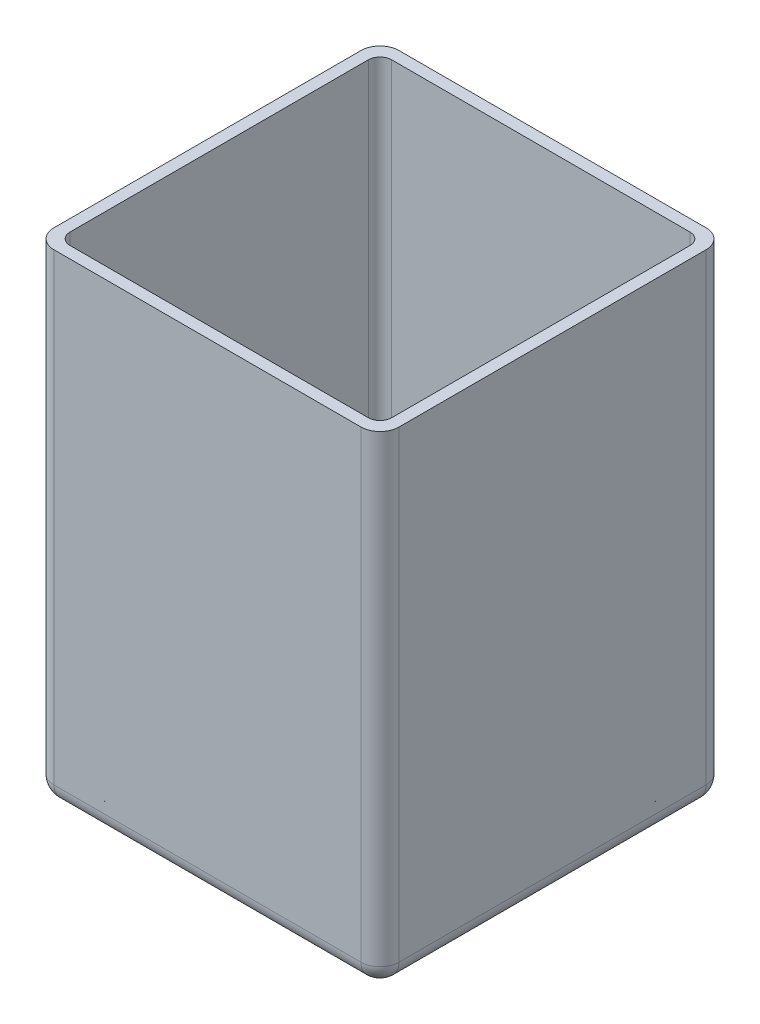
ISO-10303-21;
HEADER;
FILE_DESCRIPTION(('STEP AP214'),'2;1');
FILE_NAME('part.step','',(''),(''),'','','');
FILE_SCHEMA(('AUTOMOTIVE_DESIGN { 1 0 10303 214 1 1 1 1 }'));
ENDSEC;
DATA;
#1=APPLICATION_CONTEXT('core data for automotive mechanical design processes');
#2=APPLICATION_PROTOCOL_DEFINITION('international standard','automotive_design',2000,#1);
#3=PRODUCT_CONTEXT('',#1,'mechanical');
#4=PRODUCT('Part','Part','',(#3));
#5=PRODUCT_RELATED_PRODUCT_CATEGORY('part','',(#4));
#6=PRODUCT_DEFINITION_FORMATION('','',#4);
#7=PRODUCT_DEFINITION_CONTEXT('part definition',#1,'design');
#8=PRODUCT_DEFINITION('design','',#6,#7);
#9=PRODUCT_DEFINITION_SHAPE('','',#8);
#10=(LENGTH_UNIT() NAMED_UNIT(*) SI_UNIT(.MILLI.,.METRE.));
#11=(NAMED_UNIT(*) PLANE_ANGLE_UNIT() SI_UNIT($,.RADIAN.));
#12=(NAMED_UNIT(*) SI_UNIT($,.STERADIAN.) SOLID_ANGLE_UNIT());
#13=UNCERTAINTY_MEASURE_WITH_UNIT(LENGTH_MEASURE(1.E-05),#10,'distance_accuracy_value','');
#14=(GEOMETRIC_REPRESENTATION_CONTEXT(3) GLOBAL_UNCERTAINTY_ASSIGNED_CONTEXT((#13)) GLOBAL_UNIT_ASSIGNED_CONTEXT((#10,
#11,#12)) REPRESENTATION_CONTEXT('',''));
#15=CARTESIAN_POINT('',(0.,0.,0.));
#16=DIRECTION('',(0.,0.,1.));
#17=DIRECTION('',(1.,0.,0.));
#18=AXIS2_PLACEMENT_3D('',#15,#16,#17);
#19=CARTESIAN_POINT('',(59.,165.,-59.));
#20=DIRECTION('',(-1.,0.,0.));
#21=DIRECTION('',(0.,0.,1.));
#22=AXIS2_PLACEMENT_3D('',#19,#20,#21);
#23=PLANE('',#22);
#24=DIRECTION('',(0.,0.,-1.));
#25=VECTOR('',#24,1.);
#26=CARTESIAN_POINT('',(59.,6.50000000000001,-59.));
#27=LINE('',#26,#25);
#28=CARTESIAN_POINT('',(59.,6.50000000000001,52.5));
#29=VERTEX_POINT('',#28);
#30=CARTESIAN_POINT('',(59.,6.50000000000001,-52.5));
#31=VERTEX_POINT('',#30);
#32=EDGE_CURVE('E57',#29,#31,#27,.T.);
#33=ORIENTED_EDGE('',*,*,#32,.T.);
#34=DIRECTION('',(0.,-1.,0.));
#35=VECTOR('',#34,1.);
#36=CARTESIAN_POINT('',(59.,165.,-52.5));
#37=LINE('',#36,#35);
#38=CARTESIAN_POINT('',(59.,165.,-52.5));
#39=VERTEX_POINT('',#38);
#40=EDGE_CURVE('E349',#31,#39,#37,.F.);
#41=ORIENTED_EDGE('',*,*,#40,.T.);
#42=DIRECTION('',(0.,0.,-1.));
#43=VECTOR('',#42,1.);
#44=CARTESIAN_POINT('',(59.,165.,-59.));
#45=LINE('',#44,#43);
#46=CARTESIAN_POINT('',(59.,165.,52.5));
#47=VERTEX_POINT('',#46);
#48=EDGE_CURVE('E423',#47,#39,#45,.T.);
#49=ORIENTED_EDGE('',*,*,#48,.F.);
#50=DIRECTION('',(0.,-1.,0.));
#51=VECTOR('',#50,1.);
#52=CARTESIAN_POINT('',(59.,165.,52.5));
#53=LINE('',#52,#51);
#54=EDGE_CURVE('E62',#47,#29,#53,.T.);
#55=ORIENTED_EDGE('',*,*,#54,.T.);
#56=EDGE_LOOP('',(#33,#41,#49,#55));
#57=FACE_BOUND('',#56,.T.);
#58=ADVANCED_FACE('F39',(#57),#23,.F.);
#59=CARTESIAN_POINT('',(-59.,165.,-59.));
#60=DIRECTION('',(0.,0.,1.));
#61=DIRECTION('',(1.,0.,0.));
#62=AXIS2_PLACEMENT_3D('',#59,#60,#61);
#63=PLANE('',#62);
#64=DIRECTION('',(-1.,0.,0.));
#65=VECTOR('',#64,1.);
#66=CARTESIAN_POINT('',(-59.,6.50000000000001,-59.));
#67=LINE('',#66,#65);
#68=CARTESIAN_POINT('',(52.5,6.50000000000001,-59.));
#69=VERTEX_POINT('',#68);
#70=CARTESIAN_POINT('',(-52.5,6.50000000000001,-59.));
#71=VERTEX_POINT('',#70);
#72=EDGE_CURVE('E307',#69,#71,#67,.T.);
#73=ORIENTED_EDGE('',*,*,#72,.T.);
#74=DIRECTION('',(0.,-1.,0.));
#75=VECTOR('',#74,1.);
#76=CARTESIAN_POINT('',(-52.5,165.,-59.));
#77=LINE('',#76,#75);
#78=CARTESIAN_POINT('',(-52.5,165.,-59.));
#79=VERTEX_POINT('',#78);
#80=EDGE_CURVE('E311',#71,#79,#77,.F.);
#81=ORIENTED_EDGE('',*,*,#80,.T.);
#82=DIRECTION('',(-1.,0.,0.));
#83=VECTOR('',#82,1.);
#84=CARTESIAN_POINT('',(-59.,165.,-59.));
#85=LINE('',#84,#83);
#86=CARTESIAN_POINT('',(52.5,165.,-59.));
#87=VERTEX_POINT('',#86);
#88=EDGE_CURVE('E431',#87,#79,#85,.T.);
#89=ORIENTED_EDGE('',*,*,#88,.F.);
#90=DIRECTION('',(0.,-1.,0.));
#91=VECTOR('',#90,1.);
#92=CARTESIAN_POINT('',(52.5,165.,-59.));
#93=LINE('',#92,#91);
#94=EDGE_CURVE('E269',#87,#69,#93,.T.);
#95=ORIENTED_EDGE('',*,*,#94,.T.);
#96=EDGE_LOOP('',(#73,#81,#89,#95));
#97=FACE_BOUND('',#96,.T.);
#98=ADVANCED_FACE('F518',(#97),#63,.F.);
#99=CARTESIAN_POINT('',(-59.,165.,-59.));
#100=DIRECTION('',(1.,0.,0.));
#101=DIRECTION('',(0.,0.,-1.));
#102=AXIS2_PLACEMENT_3D('',#99,#100,#101);
#103=PLANE('',#102);
#104=DIRECTION('',(0.,0.,1.));
#105=VECTOR('',#104,1.);
#106=CARTESIAN_POINT('',(-59.,165.,-59.));
#107=LINE('',#106,#105);
#108=CARTESIAN_POINT('',(-59.,165.,-52.5));
#109=VERTEX_POINT('',#108);
#110=CARTESIAN_POINT('',(-59.,165.,52.5));
#111=VERTEX_POINT('',#110);
#112=EDGE_CURVE('E436',#109,#111,#107,.T.);
#113=ORIENTED_EDGE('',*,*,#112,.F.);
#114=DIRECTION('',(0.,-1.,0.));
#115=VECTOR('',#114,1.);
#116=CARTESIAN_POINT('',(-59.,165.,-52.5));
#117=LINE('',#116,#115);
#118=CARTESIAN_POINT('',(-59.,6.50000000000001,-52.5));
#119=VERTEX_POINT('',#118);
#120=EDGE_CURVE('E333',#109,#119,#117,.T.);
#121=ORIENTED_EDGE('',*,*,#120,.T.);
#122=DIRECTION('',(0.,0.,1.));
#123=VECTOR('',#122,1.);
#124=CARTESIAN_POINT('',(-59.,6.50000000000001,-59.));
#125=LINE('',#124,#123);
#126=CARTESIAN_POINT('',(-59.,6.50000000000001,52.5));
#127=VERTEX_POINT('',#126);
#128=EDGE_CURVE('E330',#119,#127,#125,.T.);
#129=ORIENTED_EDGE('',*,*,#128,.T.);
#130=DIRECTION('',(0.,-1.,0.));
#131=VECTOR('',#130,1.);
#132=CARTESIAN_POINT('',(-59.,165.,52.5));
#133=LINE('',#132,#131);
#134=EDGE_CURVE('E327',#127,#111,#133,.F.);
#135=ORIENTED_EDGE('',*,*,#134,.T.);
#136=EDGE_LOOP('',(#113,#121,#129,#135));
#137=FACE_BOUND('',#136,.T.);
#138=ADVANCED_FACE('F523',(#137),#103,.F.);
#139=CARTESIAN_POINT('',(-59.,165.,59.));
#140=DIRECTION('',(0.,0.,-1.));
#141=DIRECTION('',(-1.,0.,0.));
#142=AXIS2_PLACEMENT_3D('',#139,#140,#141);
#143=PLANE('',#142);
#144=DIRECTION('',(1.,0.,0.));
#145=VECTOR('',#144,1.);
#146=CARTESIAN_POINT('',(-59.,165.,59.));
#147=LINE('',#146,#145);
#148=CARTESIAN_POINT('',(-52.5,165.,59.));
#149=VERTEX_POINT('',#148);
#150=CARTESIAN_POINT('',(52.5,165.,59.));
#151=VERTEX_POINT('',#150);
#152=EDGE_CURVE('E211',#149,#151,#147,.T.);
#153=ORIENTED_EDGE('',*,*,#152,.F.);
#154=DIRECTION('',(0.,-1.,0.));
#155=VECTOR('',#154,1.);
#156=CARTESIAN_POINT('',(-52.5,165.,59.));
#157=LINE('',#156,#155);
#158=CARTESIAN_POINT('',(-52.5,6.50000000000001,59.));
#159=VERTEX_POINT('',#158);
#160=EDGE_CURVE('E342',#149,#159,#157,.T.);
#161=ORIENTED_EDGE('',*,*,#160,.T.);
#162=DIRECTION('',(1.,0.,0.));
#163=VECTOR('',#162,1.);
#164=CARTESIAN_POINT('',(-59.,6.50000000000001,59.));
#165=LINE('',#164,#163);
#166=CARTESIAN_POINT('',(52.5,6.50000000000001,59.));
#167=VERTEX_POINT('',#166);
#168=EDGE_CURVE('E339',#159,#167,#165,.T.);
#169=ORIENTED_EDGE('',*,*,#168,.T.);
#170=DIRECTION('',(0.,-1.,0.));
#171=VECTOR('',#170,1.);
#172=CARTESIAN_POINT('',(52.5,165.,59.));
#173=LINE('',#172,#171);
#174=EDGE_CURVE('E336',#167,#151,#173,.F.);
#175=ORIENTED_EDGE('',*,*,#174,.T.);
#176=EDGE_LOOP('',(#153,#161,#169,#175));
#177=FACE_BOUND('',#176,.T.);
#178=ADVANCED_FACE('F769',(#177),#143,.F.);
#179=CARTESIAN_POINT('',(0.,165.,0.));
#180=DIRECTION('',(0.,1.,0.));
#181=DIRECTION('',(0.,0.,1.));
#182=AXIS2_PLACEMENT_3D('',#179,#180,#181);
#183=PLANE('',#182);
#184=DIRECTION('',(0.,0.,-1.));
#185=VECTOR('',#184,1.);
#186=CARTESIAN_POINT('',(55.,165.,-59.));
#187=LINE('',#186,#185);
#188=CARTESIAN_POINT('',(55.,165.,51.));
#189=VERTEX_POINT('',#188);
#190=CARTESIAN_POINT('',(55.,165.,-51.));
#191=VERTEX_POINT('',#190);
#192=EDGE_CURVE('E304',#189,#191,#187,.T.);
#193=ORIENTED_EDGE('',*,*,#192,.F.);
#194=CARTESIAN_POINT('',(51.,165.,51.));
#195=DIRECTION('',(0.,1.,0.));
#196=DIRECTION('',(0.,0.,1.));
#197=AXIS2_PLACEMENT_3D('',#194,#195,#196);
#198=CIRCLE('',#197,4.);
#199=CARTESIAN_POINT('',(51.,165.,55.));
#200=VERTEX_POINT('',#199);
#201=EDGE_CURVE('E261',#189,#200,#198,.F.);
#202=ORIENTED_EDGE('',*,*,#201,.T.);
#203=DIRECTION('',(1.,0.,0.));
#204=VECTOR('',#203,1.);
#205=CARTESIAN_POINT('',(-59.,165.,55.));
#206=LINE('',#205,#204);
#207=CARTESIAN_POINT('',(-51.,165.,55.));
#208=VERTEX_POINT('',#207);
#209=EDGE_CURVE('E432',#208,#200,#206,.T.);
#210=ORIENTED_EDGE('',*,*,#209,.F.);
#211=CARTESIAN_POINT('',(-51.,165.,51.));
#212=DIRECTION('',(0.,1.,0.));
#213=DIRECTION('',(0.,0.,1.));
#214=AXIS2_PLACEMENT_3D('',#211,#212,#213);
#215=CIRCLE('',#214,4.);
#216=CARTESIAN_POINT('',(-55.,165.,51.));
#217=VERTEX_POINT('',#216);
#218=EDGE_CURVE('E264',#208,#217,#215,.F.);
#219=ORIENTED_EDGE('',*,*,#218,.T.);
#220=DIRECTION('',(0.,0.,1.));
#221=VECTOR('',#220,1.);
#222=CARTESIAN_POINT('',(-55.,165.,-59.));
#223=LINE('',#222,#221);
#224=CARTESIAN_POINT('',(-55.,165.,-51.));
#225=VERTEX_POINT('',#224);
#226=EDGE_CURVE('E439',#225,#217,#223,.T.);
#227=ORIENTED_EDGE('',*,*,#226,.F.);
#228=CARTESIAN_POINT('',(-51.,165.,-51.));
#229=DIRECTION('',(0.,1.,0.));
#230=DIRECTION('',(0.,0.,1.));
#231=AXIS2_PLACEMENT_3D('',#228,#229,#230);
#232=CIRCLE('',#231,4.);
#233=CARTESIAN_POINT('',(-51.,165.,-55.));
#234=VERTEX_POINT('',#233);
#235=EDGE_CURVE('E267',#225,#234,#232,.F.);
#236=ORIENTED_EDGE('',*,*,#235,.T.);
#237=DIRECTION('',(-1.,0.,0.));
#238=VECTOR('',#237,1.);
#239=CARTESIAN_POINT('',(-59.,165.,-55.));
#240=LINE('',#239,#238);
#241=CARTESIAN_POINT('',(51.,165.,-55.));
#242=VERTEX_POINT('',#241);
#243=EDGE_CURVE('E486',#242,#234,#240,.T.);
#244=ORIENTED_EDGE('',*,*,#243,.F.);
#245=CARTESIAN_POINT('',(51.,165.,-51.));
#246=DIRECTION('',(0.,1.,0.));
#247=DIRECTION('',(0.,0.,1.));
#248=AXIS2_PLACEMENT_3D('',#245,#246,#247);
#249=CIRCLE('',#248,4.);
#250=EDGE_CURVE('E258',#242,#191,#249,.F.);
#251=ORIENTED_EDGE('',*,*,#250,.T.);
#252=EDGE_LOOP('',(#193,#202,#210,#219,#227,#236,#244,#251));
#253=FACE_BOUND('',#252,.T.);
#254=ORIENTED_EDGE('',*,*,#88,.T.);
#255=CARTESIAN_POINT('',(-52.5,165.,-52.5));
#256=DIRECTION('',(0.,1.,0.));
#257=DIRECTION('',(0.,0.,1.));
#258=AXIS2_PLACEMENT_3D('',#255,#256,#257);
#259=CIRCLE('',#258,6.5);
#260=EDGE_CURVE('E11',#79,#109,#259,.T.);
#261=ORIENTED_EDGE('',*,*,#260,.T.);
#262=ORIENTED_EDGE('',*,*,#112,.T.);
#263=CARTESIAN_POINT('',(-52.5,165.,52.5));
#264=DIRECTION('',(0.,1.,0.));
#265=DIRECTION('',(0.,0.,1.));
#266=AXIS2_PLACEMENT_3D('',#263,#264,#265);
#267=CIRCLE('',#266,6.5);
#268=EDGE_CURVE('E49',#111,#149,#267,.T.);
#269=ORIENTED_EDGE('',*,*,#268,.T.);
#270=ORIENTED_EDGE('',*,*,#152,.T.);
#271=CARTESIAN_POINT('',(52.5,165.,52.5));
#272=DIRECTION('',(0.,1.,0.));
#273=DIRECTION('',(0.,0.,1.));
#274=AXIS2_PLACEMENT_3D('',#271,#272,#273);
#275=CIRCLE('',#274,6.5);
#276=EDGE_CURVE('E352',#151,#47,#275,.T.);
#277=ORIENTED_EDGE('',*,*,#276,.T.);
#278=ORIENTED_EDGE('',*,*,#48,.T.);
#279=CARTESIAN_POINT('',(52.5,165.,-52.5));
#280=DIRECTION('',(0.,1.,0.));
#281=DIRECTION('',(0.,0.,1.));
#282=AXIS2_PLACEMENT_3D('',#279,#280,#281);
#283=CIRCLE('',#282,6.5);
#284=EDGE_CURVE('E355',#39,#87,#283,.T.);
#285=ORIENTED_EDGE('',*,*,#284,.T.);
#286=EDGE_LOOP('',(#254,#261,#262,#269,#270,#277,#278,#285));
#287=FACE_BOUND('',#286,.T.);
#288=ADVANCED_FACE('F426',(#253,#287),#183,.T.);
#289=CARTESIAN_POINT('',(0.,0.,0.));
#290=DIRECTION('',(0.,1.,0.));
#291=DIRECTION('',(0.,0.,1.));
#292=AXIS2_PLACEMENT_3D('',#289,#290,#291);
#293=PLANE('',#292);
#294=DIRECTION('',(0.,0.,1.));
#295=VECTOR('',#294,1.);
#296=CARTESIAN_POINT('',(-52.5,0.,0.));
#297=LINE('',#296,#295);
#298=CARTESIAN_POINT('',(-52.5,0.,52.5));
#299=VERTEX_POINT('',#298);
#300=CARTESIAN_POINT('',(-52.5,0.,-52.5));
#301=VERTEX_POINT('',#300);
#302=EDGE_CURVE('E320',#299,#301,#297,.F.);
#303=ORIENTED_EDGE('',*,*,#302,.T.);
#304=DIRECTION('',(-1.,0.,0.));
#305=VECTOR('',#304,1.);
#306=CARTESIAN_POINT('',(0.,0.,-52.5));
#307=LINE('',#306,#305);
#308=CARTESIAN_POINT('',(52.5,0.,-52.5));
#309=VERTEX_POINT('',#308);
#310=EDGE_CURVE('E323',#301,#309,#307,.F.);
#311=ORIENTED_EDGE('',*,*,#310,.T.);
#312=DIRECTION('',(0.,0.,-1.));
#313=VECTOR('',#312,1.);
#314=CARTESIAN_POINT('',(52.5,0.,0.));
#315=LINE('',#314,#313);
#316=CARTESIAN_POINT('',(52.5,0.,52.5));
#317=VERTEX_POINT('',#316);
#318=EDGE_CURVE('E314',#309,#317,#315,.F.);
#319=ORIENTED_EDGE('',*,*,#318,.T.);
#320=DIRECTION('',(1.,0.,0.));
#321=VECTOR('',#320,1.);
#322=CARTESIAN_POINT('',(0.,0.,52.5));
#323=LINE('',#322,#321);
#324=EDGE_CURVE('E317',#317,#299,#323,.F.);
#325=ORIENTED_EDGE('',*,*,#324,.T.);
#326=EDGE_LOOP('',(#303,#311,#319,#325));
#327=FACE_BOUND('',#326,.T.);
#328=ADVANCED_FACE('F754',(#327),#293,.F.);
#329=CARTESIAN_POINT('',(55.,165.,-59.));
#330=DIRECTION('',(-1.,0.,0.));
#331=DIRECTION('',(0.,0.,1.));
#332=AXIS2_PLACEMENT_3D('',#329,#330,#331);
#333=PLANE('',#332);
#334=ORIENTED_EDGE('',*,*,#192,.T.);
#335=DIRECTION('',(0.,-1.,0.));
#336=VECTOR('',#335,1.);
#337=CARTESIAN_POINT('',(55.,4.,-51.));
#338=LINE('',#337,#336);
#339=CARTESIAN_POINT('',(55.,8.,-51.));
#340=VERTEX_POINT('',#339);
#341=EDGE_CURVE('E255',#191,#340,#338,.T.);
#342=ORIENTED_EDGE('',*,*,#341,.T.);
#343=DIRECTION('',(0.,0.,-1.));
#344=VECTOR('',#343,1.);
#345=CARTESIAN_POINT('',(55.,8.,55.));
#346=LINE('',#345,#344);
#347=CARTESIAN_POINT('',(55.,8.,51.));
#348=VERTEX_POINT('',#347);
#349=EDGE_CURVE('E252',#340,#348,#346,.F.);
#350=ORIENTED_EDGE('',*,*,#349,.T.);
#351=DIRECTION('',(0.,-1.,0.));
#352=VECTOR('',#351,1.);
#353=CARTESIAN_POINT('',(55.,165.,51.));
#354=LINE('',#353,#352);
#355=EDGE_CURVE('E249',#348,#189,#354,.F.);
#356=ORIENTED_EDGE('',*,*,#355,.T.);
#357=EDGE_LOOP('',(#334,#342,#350,#356));
#358=FACE_BOUND('',#357,.T.);
#359=ADVANCED_FACE('F480',(#358),#333,.T.);
#360=CARTESIAN_POINT('',(-59.,165.,-55.));
#361=DIRECTION('',(0.,0.,1.));
#362=DIRECTION('',(1.,0.,0.));
#363=AXIS2_PLACEMENT_3D('',#360,#361,#362);
#364=PLANE('',#363);
#365=DIRECTION('',(-1.,0.,0.));
#366=VECTOR('',#365,1.);
#367=CARTESIAN_POINT('',(55.,8.,-55.));
#368=LINE('',#367,#366);
#369=CARTESIAN_POINT('',(-51.,8.,-55.));
#370=VERTEX_POINT('',#369);
#371=CARTESIAN_POINT('',(51.,8.,-55.));
#372=VERTEX_POINT('',#371);
#373=EDGE_CURVE('E243',#370,#372,#368,.F.);
#374=ORIENTED_EDGE('',*,*,#373,.T.);
#375=DIRECTION('',(0.,-1.,0.));
#376=VECTOR('',#375,1.);
#377=CARTESIAN_POINT('',(51.,165.,-55.));
#378=LINE('',#377,#376);
#379=EDGE_CURVE('E246',#372,#242,#378,.F.);
#380=ORIENTED_EDGE('',*,*,#379,.T.);
#381=ORIENTED_EDGE('',*,*,#243,.T.);
#382=DIRECTION('',(0.,-1.,0.));
#383=VECTOR('',#382,1.);
#384=CARTESIAN_POINT('',(-51.,4.,-55.));
#385=LINE('',#384,#383);
#386=EDGE_CURVE('E240',#234,#370,#385,.T.);
#387=ORIENTED_EDGE('',*,*,#386,.T.);
#388=EDGE_LOOP('',(#374,#380,#381,#387));
#389=FACE_BOUND('',#388,.T.);
#390=ADVANCED_FACE('F502',(#389),#364,.T.);
#391=CARTESIAN_POINT('',(-55.,165.,-59.));
#392=DIRECTION('',(1.,0.,0.));
#393=DIRECTION('',(0.,0.,-1.));
#394=AXIS2_PLACEMENT_3D('',#391,#392,#393);
#395=PLANE('',#394);
#396=ORIENTED_EDGE('',*,*,#226,.T.);
#397=DIRECTION('',(0.,-1.,0.));
#398=VECTOR('',#397,1.);
#399=CARTESIAN_POINT('',(-55.,4.,51.));
#400=LINE('',#399,#398);
#401=CARTESIAN_POINT('',(-55.,8.,51.));
#402=VERTEX_POINT('',#401);
#403=EDGE_CURVE('E237',#217,#402,#400,.T.);
#404=ORIENTED_EDGE('',*,*,#403,.T.);
#405=DIRECTION('',(0.,0.,1.));
#406=VECTOR('',#405,1.);
#407=CARTESIAN_POINT('',(-55.,8.,-55.));
#408=LINE('',#407,#406);
#409=CARTESIAN_POINT('',(-55.,8.,-51.));
#410=VERTEX_POINT('',#409);
#411=EDGE_CURVE('E234',#402,#410,#408,.F.);
#412=ORIENTED_EDGE('',*,*,#411,.T.);
#413=DIRECTION('',(0.,-1.,0.));
#414=VECTOR('',#413,1.);
#415=CARTESIAN_POINT('',(-55.,165.,-51.));
#416=LINE('',#415,#414);
#417=EDGE_CURVE('E231',#410,#225,#416,.F.);
#418=ORIENTED_EDGE('',*,*,#417,.T.);
#419=EDGE_LOOP('',(#396,#404,#412,#418));
#420=FACE_BOUND('',#419,.T.);
#421=ADVANCED_FACE('F495',(#420),#395,.T.);
#422=CARTESIAN_POINT('',(-59.,165.,55.));
#423=DIRECTION('',(0.,0.,-1.));
#424=DIRECTION('',(-1.,0.,0.));
#425=AXIS2_PLACEMENT_3D('',#422,#423,#424);
#426=PLANE('',#425);
#427=ORIENTED_EDGE('',*,*,#209,.T.);
#428=DIRECTION('',(0.,-1.,0.));
#429=VECTOR('',#428,1.);
#430=CARTESIAN_POINT('',(51.,4.,55.));
#431=LINE('',#430,#429);
#432=CARTESIAN_POINT('',(51.,8.,55.));
#433=VERTEX_POINT('',#432);
#434=EDGE_CURVE('E228',#200,#433,#431,.T.);
#435=ORIENTED_EDGE('',*,*,#434,.T.);
#436=DIRECTION('',(1.,0.,0.));
#437=VECTOR('',#436,1.);
#438=CARTESIAN_POINT('',(-55.,8.,55.));
#439=LINE('',#438,#437);
#440=CARTESIAN_POINT('',(-51.,8.,55.));
#441=VERTEX_POINT('',#440);
#442=EDGE_CURVE('E185',#433,#441,#439,.F.);
#443=ORIENTED_EDGE('',*,*,#442,.T.);
#444=DIRECTION('',(0.,-1.,0.));
#445=VECTOR('',#444,1.);
#446=CARTESIAN_POINT('',(-51.,165.,55.));
#447=LINE('',#446,#445);
#448=EDGE_CURVE('E218',#441,#208,#447,.F.);
#449=ORIENTED_EDGE('',*,*,#448,.T.);
#450=EDGE_LOOP('',(#427,#435,#443,#449));
#451=FACE_BOUND('',#450,.T.);
#452=ADVANCED_FACE('F471',(#451),#426,.T.);
#453=CARTESIAN_POINT('',(0.,4.,0.));
#454=DIRECTION('',(0.,1.,0.));
#455=DIRECTION('',(0.,0.,1.));
#456=AXIS2_PLACEMENT_3D('',#453,#454,#455);
#457=PLANE('',#456);
#458=DIRECTION('',(0.,0.,1.));
#459=VECTOR('',#458,1.);
#460=CARTESIAN_POINT('',(-51.,4.,55.));
#461=LINE('',#460,#459);
#462=CARTESIAN_POINT('',(-51.,4.,-51.));
#463=VERTEX_POINT('',#462);
#464=CARTESIAN_POINT('',(-51.,4.,51.));
#465=VERTEX_POINT('',#464);
#466=EDGE_CURVE('E215',#463,#465,#461,.T.);
#467=ORIENTED_EDGE('',*,*,#466,.T.);
#468=DIRECTION('',(1.,0.,0.));
#469=VECTOR('',#468,1.);
#470=CARTESIAN_POINT('',(55.,4.,51.));
#471=LINE('',#470,#469);
#472=CARTESIAN_POINT('',(51.,4.,51.));
#473=VERTEX_POINT('',#472);
#474=EDGE_CURVE('E183',#465,#473,#471,.T.);
#475=ORIENTED_EDGE('',*,*,#474,.T.);
#476=DIRECTION('',(0.,0.,-1.));
#477=VECTOR('',#476,1.);
#478=CARTESIAN_POINT('',(51.,4.,-55.));
#479=LINE('',#478,#477);
#480=CARTESIAN_POINT('',(51.,4.,-51.));
#481=VERTEX_POINT('',#480);
#482=EDGE_CURVE('E203',#473,#481,#479,.T.);
#483=ORIENTED_EDGE('',*,*,#482,.T.);
#484=DIRECTION('',(-1.,0.,0.));
#485=VECTOR('',#484,1.);
#486=CARTESIAN_POINT('',(-55.,4.,-51.));
#487=LINE('',#486,#485);
#488=EDGE_CURVE('E210',#481,#463,#487,.T.);
#489=ORIENTED_EDGE('',*,*,#488,.T.);
#490=EDGE_LOOP('',(#467,#475,#483,#489));
#491=FACE_BOUND('',#490,.T.);
#492=ADVANCED_FACE('F213',(#491),#457,.T.);
#493=CARTESIAN_POINT('',(-51.,165.,-51.));
#494=DIRECTION('',(0.,1.,0.));
#495=DIRECTION('',(0.,0.,1.));
#496=AXIS2_PLACEMENT_3D('',#493,#494,#495);
#497=CYLINDRICAL_SURFACE('',#496,4.);
#498=ORIENTED_EDGE('',*,*,#235,.F.);
#499=ORIENTED_EDGE('',*,*,#417,.F.);
#500=CARTESIAN_POINT('',(-51.,8.,-51.));
#501=DIRECTION('',(0.,1.,0.));
#502=DIRECTION('',(0.,0.,1.));
#503=AXIS2_PLACEMENT_3D('',#500,#501,#502);
#504=CIRCLE('',#503,4.);
#505=EDGE_CURVE('E300',#370,#410,#504,.T.);
#506=ORIENTED_EDGE('',*,*,#505,.F.);
#507=ORIENTED_EDGE('',*,*,#386,.F.);
#508=EDGE_LOOP('',(#498,#499,#506,#507));
#509=FACE_BOUND('',#508,.T.);
#510=ADVANCED_FACE('F500',(#509),#497,.F.);
#511=CARTESIAN_POINT('',(0.,8.,-51.));
#512=DIRECTION('',(1.,0.,0.));
#513=DIRECTION('',(0.,0.,-1.));
#514=AXIS2_PLACEMENT_3D('',#511,#512,#513);
#515=CYLINDRICAL_SURFACE('',#514,4.);
#516=CARTESIAN_POINT('',(51.,8.,-51.));
#517=DIRECTION('',(-1.,0.,0.));
#518=DIRECTION('',(0.,0.,1.));
#519=AXIS2_PLACEMENT_3D('',#516,#517,#518);
#520=CIRCLE('',#519,4.);
#521=EDGE_CURVE('E292',#372,#481,#520,.T.);
#522=ORIENTED_EDGE('',*,*,#521,.F.);
#523=ORIENTED_EDGE('',*,*,#373,.F.);
#524=CARTESIAN_POINT('',(-51.,8.,-51.));
#525=DIRECTION('',(1.,0.,0.));
#526=DIRECTION('',(0.,0.,-1.));
#527=AXIS2_PLACEMENT_3D('',#524,#525,#526);
#528=CIRCLE('',#527,4.);
#529=EDGE_CURVE('E296',#463,#370,#528,.T.);
#530=ORIENTED_EDGE('',*,*,#529,.F.);
#531=ORIENTED_EDGE('',*,*,#488,.F.);
#532=EDGE_LOOP('',(#522,#523,#530,#531));
#533=FACE_BOUND('',#532,.T.);
#534=ADVANCED_FACE('F453',(#533),#515,.F.);
#535=CARTESIAN_POINT('',(51.,165.,-51.));
#536=DIRECTION('',(0.,1.,0.));
#537=DIRECTION('',(0.,0.,1.));
#538=AXIS2_PLACEMENT_3D('',#535,#536,#537);
#539=CYLINDRICAL_SURFACE('',#538,4.);
#540=ORIENTED_EDGE('',*,*,#250,.F.);
#541=ORIENTED_EDGE('',*,*,#379,.F.);
#542=CARTESIAN_POINT('',(51.,8.,-51.));
#543=DIRECTION('',(0.,1.,0.));
#544=DIRECTION('',(0.,0.,1.));
#545=AXIS2_PLACEMENT_3D('',#542,#543,#544);
#546=CIRCLE('',#545,4.);
#547=EDGE_CURVE('E288',#340,#372,#546,.T.);
#548=ORIENTED_EDGE('',*,*,#547,.F.);
#549=ORIENTED_EDGE('',*,*,#341,.F.);
#550=EDGE_LOOP('',(#540,#541,#548,#549));
#551=FACE_BOUND('',#550,.T.);
#552=ADVANCED_FACE('F505',(#551),#539,.F.);
#553=CARTESIAN_POINT('',(-51.,8.,-51.));
#554=DIRECTION('',(0.,0.,1.));
#555=DIRECTION('',(1.,0.,0.));
#556=AXIS2_PLACEMENT_3D('',#553,#554,#555);
#557=SPHERICAL_SURFACE('',#556,4.);
#558=ORIENTED_EDGE('',*,*,#529,.T.);
#559=ORIENTED_EDGE('',*,*,#505,.T.);
#560=CARTESIAN_POINT('',(-51.,8.,-51.));
#561=DIRECTION('',(0.,0.,1.));
#562=DIRECTION('',(1.,0.,0.));
#563=AXIS2_PLACEMENT_3D('',#560,#561,#562);
#564=CIRCLE('',#563,4.);
#565=EDGE_CURVE('E284',#463,#410,#564,.F.);
#566=ORIENTED_EDGE('',*,*,#565,.F.);
#567=EDGE_LOOP('',(#558,#559,#566));
#568=FACE_BOUND('',#567,.T.);
#569=ADVANCED_FACE('F456',(#568),#557,.F.);
#570=CARTESIAN_POINT('',(51.,8.,-51.));
#571=DIRECTION('',(0.,0.,1.));
#572=DIRECTION('',(1.,0.,0.));
#573=AXIS2_PLACEMENT_3D('',#570,#571,#572);
#574=SPHERICAL_SURFACE('',#573,4.);
#575=ORIENTED_EDGE('',*,*,#547,.T.);
#576=ORIENTED_EDGE('',*,*,#521,.T.);
#577=CARTESIAN_POINT('',(51.,8.,-51.));
#578=DIRECTION('',(0.,0.,1.));
#579=DIRECTION('',(1.,0.,0.));
#580=AXIS2_PLACEMENT_3D('',#577,#578,#579);
#581=CIRCLE('',#580,4.);
#582=EDGE_CURVE('E206',#340,#481,#581,.F.);
#583=ORIENTED_EDGE('',*,*,#582,.F.);
#584=EDGE_LOOP('',(#575,#576,#583));
#585=FACE_BOUND('',#584,.T.);
#586=ADVANCED_FACE('F508',(#585),#574,.F.);
#587=CARTESIAN_POINT('',(-51.,165.,51.));
#588=DIRECTION('',(0.,1.,0.));
#589=DIRECTION('',(0.,0.,1.));
#590=AXIS2_PLACEMENT_3D('',#587,#588,#589);
#591=CYLINDRICAL_SURFACE('',#590,4.);
#592=ORIENTED_EDGE('',*,*,#218,.F.);
#593=ORIENTED_EDGE('',*,*,#448,.F.);
#594=CARTESIAN_POINT('',(-51.,8.,51.));
#595=DIRECTION('',(0.,1.,0.));
#596=DIRECTION('',(0.,0.,1.));
#597=AXIS2_PLACEMENT_3D('',#594,#595,#596);
#598=CIRCLE('',#597,4.);
#599=EDGE_CURVE('E278',#402,#441,#598,.T.);
#600=ORIENTED_EDGE('',*,*,#599,.F.);
#601=ORIENTED_EDGE('',*,*,#403,.F.);
#602=EDGE_LOOP('',(#592,#593,#600,#601));
#603=FACE_BOUND('',#602,.T.);
#604=ADVANCED_FACE('F468',(#603),#591,.F.);
#605=CARTESIAN_POINT('',(-51.,8.,0.));
#606=DIRECTION('',(0.,0.,-1.));
#607=DIRECTION('',(-1.,0.,0.));
#608=AXIS2_PLACEMENT_3D('',#605,#606,#607);
#609=CYLINDRICAL_SURFACE('',#608,4.);
#610=ORIENTED_EDGE('',*,*,#565,.T.);
#611=ORIENTED_EDGE('',*,*,#411,.F.);
#612=CARTESIAN_POINT('',(-51.,8.,51.));
#613=DIRECTION('',(0.,0.,-1.));
#614=DIRECTION('',(-1.,0.,0.));
#615=AXIS2_PLACEMENT_3D('',#612,#613,#614);
#616=CIRCLE('',#615,4.);
#617=EDGE_CURVE('E200',#465,#402,#616,.T.);
#618=ORIENTED_EDGE('',*,*,#617,.F.);
#619=ORIENTED_EDGE('',*,*,#466,.F.);
#620=EDGE_LOOP('',(#610,#611,#618,#619));
#621=FACE_BOUND('',#620,.T.);
#622=ADVANCED_FACE('F459',(#621),#609,.F.);
#623=CARTESIAN_POINT('',(51.,8.,0.));
#624=DIRECTION('',(0.,0.,1.));
#625=DIRECTION('',(1.,0.,0.));
#626=AXIS2_PLACEMENT_3D('',#623,#624,#625);
#627=CYLINDRICAL_SURFACE('',#626,4.);
#628=ORIENTED_EDGE('',*,*,#582,.T.);
#629=ORIENTED_EDGE('',*,*,#482,.F.);
#630=CARTESIAN_POINT('',(51.,8.,51.));
#631=DIRECTION('',(0.,0.,-1.));
#632=DIRECTION('',(-1.,0.,0.));
#633=AXIS2_PLACEMENT_3D('',#630,#631,#632);
#634=CIRCLE('',#633,4.);
#635=EDGE_CURVE('E192',#348,#473,#634,.T.);
#636=ORIENTED_EDGE('',*,*,#635,.F.);
#637=ORIENTED_EDGE('',*,*,#349,.F.);
#638=EDGE_LOOP('',(#628,#629,#636,#637));
#639=FACE_BOUND('',#638,.T.);
#640=ADVANCED_FACE('F204',(#639),#627,.F.);
#641=CARTESIAN_POINT('',(51.,165.,51.));
#642=DIRECTION('',(0.,1.,0.));
#643=DIRECTION('',(0.,0.,1.));
#644=AXIS2_PLACEMENT_3D('',#641,#642,#643);
#645=CYLINDRICAL_SURFACE('',#644,4.);
#646=ORIENTED_EDGE('',*,*,#201,.F.);
#647=ORIENTED_EDGE('',*,*,#355,.F.);
#648=CARTESIAN_POINT('',(51.,8.,51.));
#649=DIRECTION('',(0.,1.,0.));
#650=DIRECTION('',(0.,0.,1.));
#651=AXIS2_PLACEMENT_3D('',#648,#649,#650);
#652=CIRCLE('',#651,4.);
#653=EDGE_CURVE('E196',#433,#348,#652,.T.);
#654=ORIENTED_EDGE('',*,*,#653,.F.);
#655=ORIENTED_EDGE('',*,*,#434,.F.);
#656=EDGE_LOOP('',(#646,#647,#654,#655));
#657=FACE_BOUND('',#656,.T.);
#658=ADVANCED_FACE('F476',(#657),#645,.F.);
#659=CARTESIAN_POINT('',(-51.,8.,51.));
#660=DIRECTION('',(0.,0.,1.));
#661=DIRECTION('',(1.,0.,0.));
#662=AXIS2_PLACEMENT_3D('',#659,#660,#661);
#663=SPHERICAL_SURFACE('',#662,4.);
#664=ORIENTED_EDGE('',*,*,#617,.T.);
#665=ORIENTED_EDGE('',*,*,#599,.T.);
#666=CARTESIAN_POINT('',(-51.,8.,51.));
#667=DIRECTION('',(1.,0.,0.));
#668=DIRECTION('',(0.,0.,-1.));
#669=AXIS2_PLACEMENT_3D('',#666,#667,#668);
#670=CIRCLE('',#669,4.);
#671=EDGE_CURVE('E189',#465,#441,#670,.F.);
#672=ORIENTED_EDGE('',*,*,#671,.F.);
#673=EDGE_LOOP('',(#664,#665,#672));
#674=FACE_BOUND('',#673,.T.);
#675=ADVANCED_FACE('F463',(#674),#663,.F.);
#676=CARTESIAN_POINT('',(51.,8.,51.));
#677=DIRECTION('',(0.,0.,1.));
#678=DIRECTION('',(1.,0.,0.));
#679=AXIS2_PLACEMENT_3D('',#676,#677,#678);
#680=SPHERICAL_SURFACE('',#679,4.);
#681=ORIENTED_EDGE('',*,*,#653,.T.);
#682=ORIENTED_EDGE('',*,*,#635,.T.);
#683=CARTESIAN_POINT('',(51.,8.,51.));
#684=DIRECTION('',(-1.,0.,0.));
#685=DIRECTION('',(0.,0.,1.));
#686=AXIS2_PLACEMENT_3D('',#683,#684,#685);
#687=CIRCLE('',#686,4.);
#688=EDGE_CURVE('E179',#433,#473,#687,.F.);
#689=ORIENTED_EDGE('',*,*,#688,.F.);
#690=EDGE_LOOP('',(#681,#682,#689));
#691=FACE_BOUND('',#690,.T.);
#692=ADVANCED_FACE('F194',(#691),#680,.F.);
#693=CARTESIAN_POINT('',(0.,8.,51.));
#694=DIRECTION('',(-1.,0.,0.));
#695=DIRECTION('',(0.,0.,1.));
#696=AXIS2_PLACEMENT_3D('',#693,#694,#695);
#697=CYLINDRICAL_SURFACE('',#696,4.);
#698=ORIENTED_EDGE('',*,*,#671,.T.);
#699=ORIENTED_EDGE('',*,*,#442,.F.);
#700=ORIENTED_EDGE('',*,*,#688,.T.);
#701=ORIENTED_EDGE('',*,*,#474,.F.);
#702=EDGE_LOOP('',(#698,#699,#700,#701));
#703=FACE_BOUND('',#702,.T.);
#704=ADVANCED_FACE('F181',(#703),#697,.F.);
#705=CARTESIAN_POINT('',(52.5,165.,52.5));
#706=DIRECTION('',(0.,-1.,0.));
#707=DIRECTION('',(0.,0.,-1.));
#708=AXIS2_PLACEMENT_3D('',#705,#706,#707);
#709=CYLINDRICAL_SURFACE('',#708,6.5);
#710=ORIENTED_EDGE('',*,*,#276,.F.);
#711=ORIENTED_EDGE('',*,*,#174,.F.);
#712=CARTESIAN_POINT('',(52.5,6.50000000000001,52.5));
#713=DIRECTION('',(0.,-1.,0.));
#714=DIRECTION('',(0.,0.,-1.));
#715=AXIS2_PLACEMENT_3D('',#712,#713,#714);
#716=CIRCLE('',#715,6.5);
#717=EDGE_CURVE('E397',#29,#167,#716,.T.);
#718=ORIENTED_EDGE('',*,*,#717,.F.);
#719=ORIENTED_EDGE('',*,*,#54,.F.);
#720=EDGE_LOOP('',(#710,#711,#718,#719));
#721=FACE_BOUND('',#720,.T.);
#722=ADVANCED_FACE('F41',(#721),#709,.T.);
#723=CARTESIAN_POINT('',(-52.5,165.,52.5));
#724=DIRECTION('',(0.,-1.,0.));
#725=DIRECTION('',(0.,0.,-1.));
#726=AXIS2_PLACEMENT_3D('',#723,#724,#725);
#727=CYLINDRICAL_SURFACE('',#726,6.5);
#728=ORIENTED_EDGE('',*,*,#268,.F.);
#729=ORIENTED_EDGE('',*,*,#134,.F.);
#730=CARTESIAN_POINT('',(-52.5,6.50000000000001,52.5));
#731=DIRECTION('',(0.,-1.,0.));
#732=DIRECTION('',(0.,0.,-1.));
#733=AXIS2_PLACEMENT_3D('',#730,#731,#732);
#734=CIRCLE('',#733,6.5);
#735=EDGE_CURVE('E394',#159,#127,#734,.T.);
#736=ORIENTED_EDGE('',*,*,#735,.F.);
#737=ORIENTED_EDGE('',*,*,#160,.F.);
#738=EDGE_LOOP('',(#728,#729,#736,#737));
#739=FACE_BOUND('',#738,.T.);
#740=ADVANCED_FACE('F569',(#739),#727,.T.);
#741=CARTESIAN_POINT('',(-59.,6.50000000000001,52.5));
#742=DIRECTION('',(1.,0.,0.));
#743=DIRECTION('',(0.,0.,-1.));
#744=AXIS2_PLACEMENT_3D('',#741,#742,#743);
#745=CYLINDRICAL_SURFACE('',#744,6.5);
#746=CARTESIAN_POINT('',(52.5,6.50000000000001,52.5));
#747=DIRECTION('',(1.,0.,0.));
#748=DIRECTION('',(0.,0.,-1.));
#749=AXIS2_PLACEMENT_3D('',#746,#747,#748);
#750=CIRCLE('',#749,6.5);
#751=EDGE_CURVE('E43',#167,#317,#750,.T.);
#752=ORIENTED_EDGE('',*,*,#751,.F.);
#753=ORIENTED_EDGE('',*,*,#168,.F.);
#754=CARTESIAN_POINT('',(-52.5,6.5,52.5));
#755=DIRECTION('',(-1.,0.,0.));
#756=DIRECTION('',(0.,0.,1.));
#757=AXIS2_PLACEMENT_3D('',#754,#755,#756);
#758=CIRCLE('',#757,6.5);
#759=EDGE_CURVE('E390',#299,#159,#758,.T.);
#760=ORIENTED_EDGE('',*,*,#759,.F.);
#761=ORIENTED_EDGE('',*,*,#324,.F.);
#762=EDGE_LOOP('',(#752,#753,#760,#761));
#763=FACE_BOUND('',#762,.T.);
#764=ADVANCED_FACE('F577',(#763),#745,.T.);
#765=CARTESIAN_POINT('',(52.5,6.5,52.5));
#766=DIRECTION('',(0.,0.,1.));
#767=DIRECTION('',(1.,0.,0.));
#768=AXIS2_PLACEMENT_3D('',#765,#766,#767);
#769=SPHERICAL_SURFACE('',#768,6.5);
#770=ORIENTED_EDGE('',*,*,#717,.T.);
#771=ORIENTED_EDGE('',*,*,#751,.T.);
#772=CARTESIAN_POINT('',(52.5,6.5,52.5));
#773=DIRECTION('',(0.,0.,1.));
#774=DIRECTION('',(1.,0.,0.));
#775=AXIS2_PLACEMENT_3D('',#772,#773,#774);
#776=CIRCLE('',#775,6.5);
#777=EDGE_CURVE('E386',#29,#317,#776,.F.);
#778=ORIENTED_EDGE('',*,*,#777,.F.);
#779=EDGE_LOOP('',(#770,#771,#778));
#780=FACE_BOUND('',#779,.T.);
#781=ADVANCED_FACE('F405',(#780),#769,.T.);
#782=CARTESIAN_POINT('',(-52.5,6.5,52.5));
#783=DIRECTION('',(0.,0.,1.));
#784=DIRECTION('',(1.,0.,0.));
#785=AXIS2_PLACEMENT_3D('',#782,#783,#784);
#786=SPHERICAL_SURFACE('',#785,6.5);
#787=ORIENTED_EDGE('',*,*,#759,.T.);
#788=ORIENTED_EDGE('',*,*,#735,.T.);
#789=CARTESIAN_POINT('',(-52.5,6.50000000000001,52.5));
#790=DIRECTION('',(0.,0.,1.));
#791=DIRECTION('',(1.,0.,0.));
#792=AXIS2_PLACEMENT_3D('',#789,#790,#791);
#793=CIRCLE('',#792,6.5);
#794=EDGE_CURVE('E382',#299,#127,#793,.F.);
#795=ORIENTED_EDGE('',*,*,#794,.F.);
#796=EDGE_LOOP('',(#787,#788,#795));
#797=FACE_BOUND('',#796,.T.);
#798=ADVANCED_FACE('F590',(#797),#786,.T.);
#799=CARTESIAN_POINT('',(52.5,6.50000000000001,-59.));
#800=DIRECTION('',(0.,0.,-1.));
#801=DIRECTION('',(-1.,0.,0.));
#802=AXIS2_PLACEMENT_3D('',#799,#800,#801);
#803=CYLINDRICAL_SURFACE('',#802,6.5);
#804=ORIENTED_EDGE('',*,*,#777,.T.);
#805=ORIENTED_EDGE('',*,*,#318,.F.);
#806=CARTESIAN_POINT('',(52.5,6.50000000000001,-52.5));
#807=DIRECTION('',(0.,0.,-1.));
#808=DIRECTION('',(-1.,0.,0.));
#809=AXIS2_PLACEMENT_3D('',#806,#807,#808);
#810=CIRCLE('',#809,6.5);
#811=EDGE_CURVE('E378',#31,#309,#810,.T.);
#812=ORIENTED_EDGE('',*,*,#811,.F.);
#813=ORIENTED_EDGE('',*,*,#32,.F.);
#814=EDGE_LOOP('',(#804,#805,#812,#813));
#815=FACE_BOUND('',#814,.T.);
#816=ADVANCED_FACE('F411',(#815),#803,.T.);
#817=CARTESIAN_POINT('',(52.5,165.,-52.5));
#818=DIRECTION('',(0.,-1.,0.));
#819=DIRECTION('',(0.,0.,-1.));
#820=AXIS2_PLACEMENT_3D('',#817,#818,#819);
#821=CYLINDRICAL_SURFACE('',#820,6.5);
#822=ORIENTED_EDGE('',*,*,#284,.F.);
#823=ORIENTED_EDGE('',*,*,#40,.F.);
#824=CARTESIAN_POINT('',(52.5,6.50000000000001,-52.5));
#825=DIRECTION('',(0.,-1.,0.));
#826=DIRECTION('',(0.,0.,-1.));
#827=AXIS2_PLACEMENT_3D('',#824,#825,#826);
#828=CIRCLE('',#827,6.5);
#829=EDGE_CURVE('E374',#69,#31,#828,.T.);
#830=ORIENTED_EDGE('',*,*,#829,.F.);
#831=ORIENTED_EDGE('',*,*,#94,.F.);
#832=EDGE_LOOP('',(#822,#823,#830,#831));
#833=FACE_BOUND('',#832,.T.);
#834=ADVANCED_FACE('F421',(#833),#821,.T.);
#835=CARTESIAN_POINT('',(-52.5,165.,-52.5));
#836=DIRECTION('',(0.,-1.,0.));
#837=DIRECTION('',(0.,0.,-1.));
#838=AXIS2_PLACEMENT_3D('',#835,#836,#837);
#839=CYLINDRICAL_SURFACE('',#838,6.5);
#840=ORIENTED_EDGE('',*,*,#260,.F.);
#841=ORIENTED_EDGE('',*,*,#80,.F.);
#842=CARTESIAN_POINT('',(-52.5,6.50000000000001,-52.5));
#843=DIRECTION('',(0.,-1.,0.));
#844=DIRECTION('',(0.,0.,-1.));
#845=AXIS2_PLACEMENT_3D('',#842,#843,#844);
#846=CIRCLE('',#845,6.5);
#847=EDGE_CURVE('E370',#119,#71,#846,.T.);
#848=ORIENTED_EDGE('',*,*,#847,.F.);
#849=ORIENTED_EDGE('',*,*,#120,.F.);
#850=EDGE_LOOP('',(#840,#841,#848,#849));
#851=FACE_BOUND('',#850,.T.);
#852=ADVANCED_FACE('F610',(#851),#839,.T.);
#853=CARTESIAN_POINT('',(-52.5,6.50000000000001,-59.));
#854=DIRECTION('',(0.,0.,1.));
#855=DIRECTION('',(1.,0.,0.));
#856=AXIS2_PLACEMENT_3D('',#853,#854,#855);
#857=CYLINDRICAL_SURFACE('',#856,6.5);
#858=ORIENTED_EDGE('',*,*,#794,.T.);
#859=ORIENTED_EDGE('',*,*,#128,.F.);
#860=CARTESIAN_POINT('',(-52.5,6.5,-52.5));
#861=DIRECTION('',(0.,0.,-1.));
#862=DIRECTION('',(-1.,0.,0.));
#863=AXIS2_PLACEMENT_3D('',#860,#861,#862);
#864=CIRCLE('',#863,6.5);
#865=EDGE_CURVE('E366',#301,#119,#864,.T.);
#866=ORIENTED_EDGE('',*,*,#865,.F.);
#867=ORIENTED_EDGE('',*,*,#302,.F.);
#868=EDGE_LOOP('',(#858,#859,#866,#867));
#869=FACE_BOUND('',#868,.T.);
#870=ADVANCED_FACE('F617',(#869),#857,.T.);
#871=CARTESIAN_POINT('',(52.5,6.5,-52.5));
#872=DIRECTION('',(0.,0.,1.));
#873=DIRECTION('',(1.,0.,0.));
#874=AXIS2_PLACEMENT_3D('',#871,#872,#873);
#875=SPHERICAL_SURFACE('',#874,6.5);
#876=ORIENTED_EDGE('',*,*,#829,.T.);
#877=ORIENTED_EDGE('',*,*,#811,.T.);
#878=CARTESIAN_POINT('',(52.5,6.5,-52.5));
#879=DIRECTION('',(1.,0.,0.));
#880=DIRECTION('',(0.,0.,-1.));
#881=AXIS2_PLACEMENT_3D('',#878,#879,#880);
#882=CIRCLE('',#881,6.5);
#883=EDGE_CURVE('E363',#69,#309,#882,.F.);
#884=ORIENTED_EDGE('',*,*,#883,.F.);
#885=EDGE_LOOP('',(#876,#877,#884));
#886=FACE_BOUND('',#885,.T.);
#887=ADVANCED_FACE('F416',(#886),#875,.T.);
#888=CARTESIAN_POINT('',(-52.5,6.5,-52.5));
#889=DIRECTION('',(0.,0.,1.));
#890=DIRECTION('',(1.,0.,0.));
#891=AXIS2_PLACEMENT_3D('',#888,#889,#890);
#892=SPHERICAL_SURFACE('',#891,6.5);
#893=ORIENTED_EDGE('',*,*,#865,.T.);
#894=ORIENTED_EDGE('',*,*,#847,.T.);
#895=CARTESIAN_POINT('',(-52.5,6.50000000000001,-52.5));
#896=DIRECTION('',(-1.,0.,0.));
#897=DIRECTION('',(0.,0.,1.));
#898=AXIS2_PLACEMENT_3D('',#895,#896,#897);
#899=CIRCLE('',#898,6.5);
#900=EDGE_CURVE('E360',#301,#71,#899,.F.);
#901=ORIENTED_EDGE('',*,*,#900,.F.);
#902=EDGE_LOOP('',(#893,#894,#901));
#903=FACE_BOUND('',#902,.T.);
#904=ADVANCED_FACE('F632',(#903),#892,.T.);
#905=CARTESIAN_POINT('',(-59.,6.50000000000001,-52.5));
#906=DIRECTION('',(-1.,0.,0.));
#907=DIRECTION('',(0.,0.,1.));
#908=AXIS2_PLACEMENT_3D('',#905,#906,#907);
#909=CYLINDRICAL_SURFACE('',#908,6.5);
#910=ORIENTED_EDGE('',*,*,#883,.T.);
#911=ORIENTED_EDGE('',*,*,#310,.F.);
#912=ORIENTED_EDGE('',*,*,#900,.T.);
#913=ORIENTED_EDGE('',*,*,#72,.F.);
#914=EDGE_LOOP('',(#910,#911,#912,#913));
#915=FACE_BOUND('',#914,.T.);
#916=ADVANCED_FACE('F639',(#915),#909,.T.);
#917=CLOSED_SHELL('',(#58,#98,#138,#178,#288,#328,#359,#390,#421,#452,#492,#510,#534,#552,#569,
#586,#604,#622,#640,#658,#675,#692,#704,#722,#740,#764,#781,#798,#816,#834,#852,#870,#887,#904,#916));
#918=MANIFOLD_SOLID_BREP('B2',#917);
#919=ADVANCED_BREP_SHAPE_REPRESENTATION('',(#18,#918),#14);
#920=SHAPE_DEFINITION_REPRESENTATION(#9,#919);
ENDSEC;
END-ISO-10303-21;
